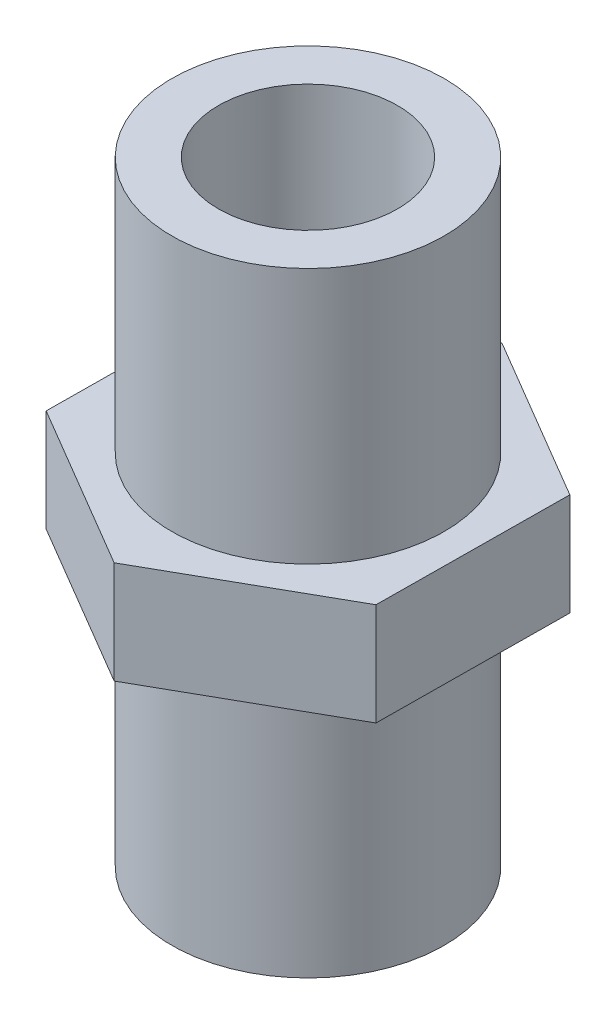
ISO-10303-21;
HEADER;
FILE_DESCRIPTION(('STEP AP214'),'2;1');
FILE_NAME('part.step','',(''),(''),'','','');
FILE_SCHEMA(('AUTOMOTIVE_DESIGN { 1 0 10303 214 1 1 1 1 }'));
ENDSEC;
DATA;
#1=APPLICATION_CONTEXT('core data for automotive mechanical design processes');
#2=APPLICATION_PROTOCOL_DEFINITION('international standard','automotive_design',2000,#1);
#3=PRODUCT_CONTEXT('',#1,'mechanical');
#4=PRODUCT('Part','Part','',(#3));
#5=PRODUCT_RELATED_PRODUCT_CATEGORY('part','',(#4));
#6=PRODUCT_DEFINITION_FORMATION('','',#4);
#7=PRODUCT_DEFINITION_CONTEXT('part definition',#1,'design');
#8=PRODUCT_DEFINITION('design','',#6,#7);
#9=PRODUCT_DEFINITION_SHAPE('','',#8);
#10=(LENGTH_UNIT() NAMED_UNIT(*) SI_UNIT(.MILLI.,.METRE.));
#11=(NAMED_UNIT(*) PLANE_ANGLE_UNIT() SI_UNIT($,.RADIAN.));
#12=(NAMED_UNIT(*) SI_UNIT($,.STERADIAN.) SOLID_ANGLE_UNIT());
#13=UNCERTAINTY_MEASURE_WITH_UNIT(LENGTH_MEASURE(1.E-05),#10,'distance_accuracy_value','');
#14=(GEOMETRIC_REPRESENTATION_CONTEXT(3) GLOBAL_UNCERTAINTY_ASSIGNED_CONTEXT((#13)) GLOBAL_UNIT_ASSIGNED_CONTEXT((#10,
#11,#12)) REPRESENTATION_CONTEXT('',''));
#15=CARTESIAN_POINT('',(0.,0.,0.));
#16=DIRECTION('',(0.,0.,1.));
#17=DIRECTION('',(1.,0.,0.));
#18=AXIS2_PLACEMENT_3D('',#15,#16,#17);
#19=CARTESIAN_POINT('',(0.,24.,7.7715611723761E-13));
#20=DIRECTION('',(0.,-1.,0.));
#21=DIRECTION('',(0.,0.,-1.));
#22=AXIS2_PLACEMENT_3D('',#19,#20,#21);
#23=CYLINDRICAL_SURFACE('',#22,10.65);
#24=CARTESIAN_POINT('',(0.,4.,0.));
#25=DIRECTION('',(0.,1.,0.));
#26=DIRECTION('',(0.,0.,1.));
#27=AXIS2_PLACEMENT_3D('',#24,#25,#26);
#28=CIRCLE('',#27,10.65);
#29=CARTESIAN_POINT('',(0.,4.00000000000001,-10.6499999999992));
#30=VERTEX_POINT('',#29);
#31=EDGE_CURVE('E144',#30,#30,#28,.T.);
#32=CARTESIAN_POINT('',(0.,24.,7.7715611723761E-13));
#33=DIRECTION('',(0.,1.,0.));
#34=DIRECTION('',(0.,0.,1.));
#35=AXIS2_PLACEMENT_3D('',#32,#33,#34);
#36=CIRCLE('',#35,10.65);
#37=CARTESIAN_POINT('',(0.,24.,-10.6499999999992));
#38=VERTEX_POINT('',#37);
#39=EDGE_CURVE('E145',#38,#38,#36,.T.);
#40=CARTESIAN_POINT('',(0.,4.00000000000001,-10.6499999999992));
#41=CARTESIAN_POINT('',(0.,4.20833333333334,-10.6499999999992));
#42=CARTESIAN_POINT('',(0.,4.41666666666667,-10.6499999999992));
#43=CARTESIAN_POINT('',(0.,4.83333333333334,-10.6499999999992));
#44=CARTESIAN_POINT('',(0.,5.04166666666667,-10.6499999999992));
#45=CARTESIAN_POINT('',(0.,5.45833333333334,-10.6499999999992));
#46=CARTESIAN_POINT('',(0.,5.66666666666667,-10.6499999999992));
#47=CARTESIAN_POINT('',(0.,6.08333333333334,-10.6499999999992));
#48=CARTESIAN_POINT('',(0.,6.29166666666668,-10.6499999999992));
#49=CARTESIAN_POINT('',(0.,6.70833333333334,-10.6499999999992));
#50=CARTESIAN_POINT('',(0.,6.91666666666668,-10.6499999999992));
#51=CARTESIAN_POINT('',(0.,7.33333333333334,-10.6499999999992));
#52=CARTESIAN_POINT('',(0.,7.54166666666668,-10.6499999999992));
#53=CARTESIAN_POINT('',(0.,7.95833333333334,-10.6499999999992));
#54=CARTESIAN_POINT('',(0.,8.16666666666668,-10.6499999999992));
#55=CARTESIAN_POINT('',(0.,8.58333333333334,-10.6499999999992));
#56=CARTESIAN_POINT('',(0.,8.79166666666668,-10.6499999999992));
#57=CARTESIAN_POINT('',(0.,9.20833333333334,-10.6499999999992));
#58=CARTESIAN_POINT('',(0.,9.41666666666668,-10.6499999999992));
#59=CARTESIAN_POINT('',(0.,9.83333333333334,-10.6499999999992));
#60=CARTESIAN_POINT('',(0.,10.0416666666667,-10.6499999999992));
#61=CARTESIAN_POINT('',(0.,10.4583333333333,-10.6499999999992));
#62=CARTESIAN_POINT('',(0.,10.6666666666667,-10.6499999999992));
#63=CARTESIAN_POINT('',(0.,11.0833333333333,-10.6499999999992));
#64=CARTESIAN_POINT('',(0.,11.2916666666667,-10.6499999999992));
#65=CARTESIAN_POINT('',(0.,11.7083333333333,-10.6499999999992));
#66=CARTESIAN_POINT('',(0.,11.9166666666667,-10.6499999999992));
#67=CARTESIAN_POINT('',(0.,12.3333333333333,-10.6499999999992));
#68=CARTESIAN_POINT('',(0.,12.5416666666667,-10.6499999999992));
#69=CARTESIAN_POINT('',(0.,12.9583333333333,-10.6499999999992));
#70=CARTESIAN_POINT('',(0.,13.1666666666667,-10.6499999999992));
#71=CARTESIAN_POINT('',(0.,13.5833333333333,-10.6499999999992));
#72=CARTESIAN_POINT('',(0.,13.7916666666667,-10.6499999999992));
#73=CARTESIAN_POINT('',(0.,14.2083333333333,-10.6499999999992));
#74=CARTESIAN_POINT('',(0.,14.4166666666667,-10.6499999999992));
#75=CARTESIAN_POINT('',(0.,14.8333333333333,-10.6499999999992));
#76=CARTESIAN_POINT('',(0.,15.0416666666667,-10.6499999999992));
#77=CARTESIAN_POINT('',(0.,15.4583333333333,-10.6499999999992));
#78=CARTESIAN_POINT('',(0.,15.6666666666667,-10.6499999999992));
#79=CARTESIAN_POINT('',(0.,16.0833333333334,-10.6499999999992));
#80=CARTESIAN_POINT('',(0.,16.2916666666667,-10.6499999999992));
#81=CARTESIAN_POINT('',(0.,16.7083333333334,-10.6499999999992));
#82=CARTESIAN_POINT('',(0.,16.9166666666667,-10.6499999999992));
#83=CARTESIAN_POINT('',(0.,17.3333333333334,-10.6499999999992));
#84=CARTESIAN_POINT('',(0.,17.5416666666667,-10.6499999999992));
#85=CARTESIAN_POINT('',(0.,17.9583333333334,-10.6499999999992));
#86=CARTESIAN_POINT('',(0.,18.1666666666667,-10.6499999999992));
#87=CARTESIAN_POINT('',(0.,18.5833333333334,-10.6499999999992));
#88=CARTESIAN_POINT('',(0.,18.7916666666667,-10.6499999999992));
#89=CARTESIAN_POINT('',(0.,19.2083333333334,-10.6499999999992));
#90=CARTESIAN_POINT('',(0.,19.4166666666667,-10.6499999999992));
#91=CARTESIAN_POINT('',(0.,19.8333333333334,-10.6499999999992));
#92=CARTESIAN_POINT('',(0.,20.0416666666667,-10.6499999999992));
#93=CARTESIAN_POINT('',(0.,20.4583333333334,-10.6499999999992));
#94=CARTESIAN_POINT('',(0.,20.6666666666667,-10.6499999999992));
#95=CARTESIAN_POINT('',(0.,21.0833333333334,-10.6499999999992));
#96=CARTESIAN_POINT('',(0.,21.2916666666667,-10.6499999999992));
#97=CARTESIAN_POINT('',(0.,21.7083333333334,-10.6499999999992));
#98=CARTESIAN_POINT('',(0.,21.9166666666667,-10.6499999999992));
#99=CARTESIAN_POINT('',(0.,22.3333333333334,-10.6499999999992));
#100=CARTESIAN_POINT('',(0.,22.5416666666667,-10.6499999999992));
#101=CARTESIAN_POINT('',(0.,22.9583333333334,-10.6499999999992));
#102=CARTESIAN_POINT('',(0.,23.1666666666667,-10.6499999999992));
#103=CARTESIAN_POINT('',(0.,23.5833333333334,-10.6499999999992));
#104=CARTESIAN_POINT('',(0.,23.7916666666667,-10.6499999999992));
#105=CARTESIAN_POINT('',(0.,24.,-10.6499999999992));
#106=B_SPLINE_CURVE_WITH_KNOTS('',3,(#40,#41,#42,#43,#44,#45,#46,#47,#48,#49,#50,#51,#52,#53,
#54,#55,#56,#57,#58,#59,#60,#61,#62,#63,#64,#65,#66,#67,#68,#69,#70,#71,#72,#73,#74,#75,#76,#77,
#78,#79,#80,#81,#82,#83,#84,#85,#86,#87,#88,#89,#90,#91,#92,#93,#94,#95,#96,#97,#98,#99,#100,
#101,#102,#103,#104,#105),.UNSPECIFIED.,.F.,.F.,(4,2,2,2,2,2,2,2,2,2,2,2,2,2,2,2,2,2,2,2,2,2,2,
2,2,2,2,2,2,2,2,2,4),(0.,0.625000000000001,1.25,1.875,2.5,3.125,3.75,4.375,5.,5.62500000000001,
6.25000000000001,6.87500000000001,7.50000000000001,8.12500000000001,8.75000000000001,
9.37500000000001,10.,10.625,11.25,11.875,12.5,13.125,13.75,14.375,15.,15.625,16.25,16.875,17.5,
18.125,18.75,19.375,20.),.UNSPECIFIED.);
#107=EDGE_CURVE('BSEAM38',#30,#38,#106,.T.);
#108=ORIENTED_EDGE('',*,*,#31,.T.);
#109=ORIENTED_EDGE('',*,*,#39,.F.);
#110=ORIENTED_EDGE('',*,*,#107,.T.);
#111=ORIENTED_EDGE('',*,*,#107,.F.);
#112=EDGE_LOOP('',(#108,#110,#109,#111));
#113=FACE_BOUND('',#112,.T.);
#114=ADVANCED_FACE('F38',(#113),#23,.T.);
#115=CARTESIAN_POINT('',(0.,24.,7.7715611723761E-13));
#116=DIRECTION('',(0.,1.,0.));
#117=DIRECTION('',(0.,0.,1.));
#118=AXIS2_PLACEMENT_3D('',#115,#116,#117);
#119=PLANE('',#118);
#120=CARTESIAN_POINT('',(0.,24.,7.7715611723761E-13));
#121=DIRECTION('',(0.,1.,0.));
#122=DIRECTION('',(0.,0.,1.));
#123=AXIS2_PLACEMENT_3D('',#120,#121,#122);
#124=CIRCLE('',#123,7.);
#125=CARTESIAN_POINT('',(0.,24.,7.00000000000067));
#126=VERTEX_POINT('',#125);
#127=EDGE_CURVE('E128',#126,#126,#124,.T.);
#128=ORIENTED_EDGE('',*,*,#127,.F.);
#129=EDGE_LOOP('',(#128));
#130=FACE_BOUND('',#129,.T.);
#131=ORIENTED_EDGE('',*,*,#39,.T.);
#132=EDGE_LOOP('',(#131));
#133=FACE_BOUND('',#132,.T.);
#134=ADVANCED_FACE('F171',(#130,#133),#119,.T.);
#135=CARTESIAN_POINT('',(12.9321995205376,3.99999999999989,7.62178121532975));
#136=DIRECTION('',(-0.999959824437242,0.,-0.00896378889999261));
#137=DIRECTION('',(-0.00896378889999261,0.,0.999959824437241));
#138=AXIS2_PLACEMENT_3D('',#135,#136,#137);
#139=PLANE('',#138);
#140=DIRECTION('',(0.00896378889999266,0.,-0.999959824437241));
#141=VECTOR('',#140,1.);
#142=CARTESIAN_POINT('',(12.932199520538,-4.00000000000011,7.62178121532997));
#143=LINE('',#142,#141);
#144=CARTESIAN_POINT('',(12.932199520538,-4.00000000000011,7.62178121532997));
#145=VERTEX_POINT('',#144);
#146=CARTESIAN_POINT('',(13.0667559148319,-3.99999999999989,-7.38872270392954));
#147=VERTEX_POINT('',#146);
#148=EDGE_CURVE('E124',#145,#147,#143,.T.);
#149=ORIENTED_EDGE('',*,*,#148,.T.);
#150=DIRECTION('',(0.,-1.,0.));
#151=VECTOR('',#150,1.);
#152=CARTESIAN_POINT('',(13.0667559148319,4.,-7.38872270392976));
#153=LINE('',#152,#151);
#154=CARTESIAN_POINT('',(13.0667559148319,4.,-7.38872270392976));
#155=VERTEX_POINT('',#154);
#156=EDGE_CURVE('E142',#155,#147,#153,.T.);
#157=ORIENTED_EDGE('',*,*,#156,.F.);
#158=DIRECTION('',(0.00896378889999266,0.,-0.999959824437241));
#159=VECTOR('',#158,1.);
#160=CARTESIAN_POINT('',(12.9321995205376,3.99999999999989,7.62178121532975));
#161=LINE('',#160,#159);
#162=CARTESIAN_POINT('',(12.9321995205376,3.99999999999989,7.62178121532975));
#163=VERTEX_POINT('',#162);
#164=EDGE_CURVE('E135',#163,#155,#161,.T.);
#165=ORIENTED_EDGE('',*,*,#164,.F.);
#166=DIRECTION('',(0.,-1.,0.));
#167=VECTOR('',#166,1.);
#168=CARTESIAN_POINT('',(12.9321995205376,3.99999999999989,7.62178121532975));
#169=LINE('',#168,#167);
#170=EDGE_CURVE('E120',#163,#145,#169,.T.);
#171=ORIENTED_EDGE('',*,*,#170,.T.);
#172=EDGE_LOOP('',(#149,#157,#165,#171));
#173=FACE_BOUND('',#172,.T.);
#174=ADVANCED_FACE('F175',(#173),#139,.F.);
#175=CARTESIAN_POINT('',(13.0667559148319,4.,-7.38872270392976));
#176=DIRECTION('',(-0.507742781120176,0.,0.861508716276482));
#177=DIRECTION('',(0.861508716276482,0.,0.507742781120175));
#178=AXIS2_PLACEMENT_3D('',#175,#176,#177);
#179=PLANE('',#178);
#180=DIRECTION('',(-0.861508716276482,0.,-0.507742781120175));
#181=VECTOR('',#180,1.);
#182=CARTESIAN_POINT('',(13.0667559148319,-3.99999999999989,-7.38872270392954));
#183=LINE('',#182,#181);
#184=CARTESIAN_POINT('',(0.13455639429516,-4.,-15.0105039192595));
#185=VERTEX_POINT('',#184);
#186=EDGE_CURVE('E127',#147,#185,#183,.T.);
#187=ORIENTED_EDGE('',*,*,#186,.T.);
#188=DIRECTION('',(0.,-1.,0.));
#189=VECTOR('',#188,1.);
#190=CARTESIAN_POINT('',(0.134556394293828,4.,-15.0105039192594));
#191=LINE('',#190,#189);
#192=CARTESIAN_POINT('',(0.134556394293828,4.,-15.0105039192594));
#193=VERTEX_POINT('',#192);
#194=EDGE_CURVE('E139',#193,#185,#191,.T.);
#195=ORIENTED_EDGE('',*,*,#194,.F.);
#196=DIRECTION('',(-0.861508716276482,0.,-0.507742781120175));
#197=VECTOR('',#196,1.);
#198=CARTESIAN_POINT('',(13.0667559148319,4.,-7.38872270392976));
#199=LINE('',#198,#197);
#200=EDGE_CURVE('E93',#155,#193,#199,.T.);
#201=ORIENTED_EDGE('',*,*,#200,.F.);
#202=ORIENTED_EDGE('',*,*,#156,.T.);
#203=EDGE_LOOP('',(#187,#195,#201,#202));
#204=FACE_BOUND('',#203,.T.);
#205=ADVANCED_FACE('F202',(#204),#179,.F.);
#206=CARTESIAN_POINT('',(0.134556394293828,4.,-15.0105039192594));
#207=DIRECTION('',(0.492217043317066,0.,0.870472505176475));
#208=DIRECTION('',(0.870472505176475,0.,-0.492217043317066));
#209=AXIS2_PLACEMENT_3D('',#206,#207,#208);
#210=PLANE('',#209);
#211=DIRECTION('',(-0.870472505176475,0.,0.492217043317066));
#212=VECTOR('',#211,1.);
#213=CARTESIAN_POINT('',(0.13455639429516,-4.,-15.0105039192595));
#214=LINE('',#213,#212);
#215=CARTESIAN_POINT('',(-12.9321995205363,-4.,-7.62178121532964));
#216=VERTEX_POINT('',#215);
#217=EDGE_CURVE('E130',#185,#216,#214,.T.);
#218=ORIENTED_EDGE('',*,*,#217,.T.);
#219=DIRECTION('',(0.,-1.,0.));
#220=VECTOR('',#219,1.);
#221=CARTESIAN_POINT('',(-12.9321995205367,4.,-7.62178121532853));
#222=LINE('',#221,#220);
#223=CARTESIAN_POINT('',(-12.9321995205367,4.,-7.62178121532853));
#224=VERTEX_POINT('',#223);
#225=EDGE_CURVE('E115',#224,#216,#222,.T.);
#226=ORIENTED_EDGE('',*,*,#225,.F.);
#227=DIRECTION('',(-0.870472505176475,0.,0.492217043317066));
#228=VECTOR('',#227,1.);
#229=CARTESIAN_POINT('',(0.134556394293828,4.,-15.0105039192594));
#230=LINE('',#229,#228);
#231=EDGE_CURVE('E106',#193,#224,#230,.T.);
#232=ORIENTED_EDGE('',*,*,#231,.F.);
#233=ORIENTED_EDGE('',*,*,#194,.T.);
#234=EDGE_LOOP('',(#218,#226,#232,#233));
#235=FACE_BOUND('',#234,.T.);
#236=ADVANCED_FACE('F204',(#235),#210,.F.);
#237=CARTESIAN_POINT('',(-12.9321995205367,4.,-7.62178121532853));
#238=DIRECTION('',(0.999959824437242,0.,0.00896378889999222));
#239=DIRECTION('',(0.0089637888999925,0.,-0.999959824437241));
#240=AXIS2_PLACEMENT_3D('',#237,#238,#239);
#241=PLANE('',#240);
#242=DIRECTION('',(-0.0089637888999925,0.,0.999959824437241));
#243=VECTOR('',#242,1.);
#244=CARTESIAN_POINT('',(-12.9321995205363,-4.,-7.62178121532964));
#245=LINE('',#244,#243);
#246=CARTESIAN_POINT('',(-13.0667559148296,-4.,7.38872270392976));
#247=VERTEX_POINT('',#246);
#248=EDGE_CURVE('E114',#216,#247,#245,.T.);
#249=ORIENTED_EDGE('',*,*,#248,.T.);
#250=DIRECTION('',(0.,-1.,0.));
#251=VECTOR('',#250,1.);
#252=CARTESIAN_POINT('',(-13.0667559148301,4.,7.3887227039301));
#253=LINE('',#252,#251);
#254=CARTESIAN_POINT('',(-13.0667559148301,4.,7.3887227039301));
#255=VERTEX_POINT('',#254);
#256=EDGE_CURVE('E111',#255,#247,#253,.T.);
#257=ORIENTED_EDGE('',*,*,#256,.F.);
#258=DIRECTION('',(-0.0089637888999925,0.,0.999959824437241));
#259=VECTOR('',#258,1.);
#260=CARTESIAN_POINT('',(-12.9321995205367,4.,-7.62178121532853));
#261=LINE('',#260,#259);
#262=EDGE_CURVE('E100',#224,#255,#261,.T.);
#263=ORIENTED_EDGE('',*,*,#262,.F.);
#264=ORIENTED_EDGE('',*,*,#225,.T.);
#265=EDGE_LOOP('',(#249,#257,#263,#264));
#266=FACE_BOUND('',#265,.T.);
#267=ADVANCED_FACE('F112',(#266),#241,.F.);
#268=CARTESIAN_POINT('',(-13.0667559148301,4.,7.3887227039301));
#269=DIRECTION('',(0.507742781120176,0.,-0.861508716276482));
#270=DIRECTION('',(-0.861508716276482,0.,-0.507742781120175));
#271=AXIS2_PLACEMENT_3D('',#268,#269,#270);
#272=PLANE('',#271);
#273=DIRECTION('',(0.861508716276482,0.,0.507742781120175));
#274=VECTOR('',#273,1.);
#275=CARTESIAN_POINT('',(-13.0667559148296,-4.,7.38872270392976));
#276=LINE('',#275,#274);
#277=CARTESIAN_POINT('',(-0.134556394292495,-4.,15.0105039192588));
#278=VERTEX_POINT('',#277);
#279=EDGE_CURVE('E78',#247,#278,#276,.T.);
#280=ORIENTED_EDGE('',*,*,#279,.T.);
#281=DIRECTION('',(0.,-1.,0.));
#282=VECTOR('',#281,1.);
#283=CARTESIAN_POINT('',(-0.134556394293384,4.,15.0105039192587));
#284=LINE('',#283,#282);
#285=CARTESIAN_POINT('',(-0.134556394293384,4.,15.0105039192587));
#286=VERTEX_POINT('',#285);
#287=EDGE_CURVE('E116',#286,#278,#284,.T.);
#288=ORIENTED_EDGE('',*,*,#287,.F.);
#289=DIRECTION('',(0.861508716276482,0.,0.507742781120175));
#290=VECTOR('',#289,1.);
#291=CARTESIAN_POINT('',(-13.0667559148301,4.,7.3887227039301));
#292=LINE('',#291,#290);
#293=EDGE_CURVE('E104',#255,#286,#292,.T.);
#294=ORIENTED_EDGE('',*,*,#293,.F.);
#295=ORIENTED_EDGE('',*,*,#256,.T.);
#296=EDGE_LOOP('',(#280,#288,#294,#295));
#297=FACE_BOUND('',#296,.T.);
#298=ADVANCED_FACE('F118',(#297),#272,.F.);
#299=CARTESIAN_POINT('',(-0.134556394293384,4.,15.0105039192587));
#300=DIRECTION('',(-0.492217043317067,0.,-0.870472505176475));
#301=DIRECTION('',(-0.870472505176474,0.,0.492217043317066));
#302=AXIS2_PLACEMENT_3D('',#299,#300,#301);
#303=PLANE('',#302);
#304=DIRECTION('',(0.870472505176475,0.,-0.492217043317066));
#305=VECTOR('',#304,1.);
#306=CARTESIAN_POINT('',(-0.134556394292495,-4.,15.0105039192588));
#307=LINE('',#306,#305);
#308=EDGE_CURVE('E84',#278,#145,#307,.T.);
#309=ORIENTED_EDGE('',*,*,#308,.T.);
#310=ORIENTED_EDGE('',*,*,#170,.F.);
#311=DIRECTION('',(0.870472505176475,0.,-0.492217043317066));
#312=VECTOR('',#311,1.);
#313=CARTESIAN_POINT('',(-0.134556394293384,4.,15.0105039192587));
#314=LINE('',#313,#312);
#315=EDGE_CURVE('E55',#286,#163,#314,.T.);
#316=ORIENTED_EDGE('',*,*,#315,.F.);
#317=ORIENTED_EDGE('',*,*,#287,.T.);
#318=EDGE_LOOP('',(#309,#310,#316,#317));
#319=FACE_BOUND('',#318,.T.);
#320=ADVANCED_FACE('F159',(#319),#303,.F.);
#321=CARTESIAN_POINT('',(0.,4.,0.));
#322=DIRECTION('',(0.,1.,0.));
#323=DIRECTION('',(0.,0.,1.));
#324=AXIS2_PLACEMENT_3D('',#321,#322,#323);
#325=PLANE('',#324);
#326=ORIENTED_EDGE('',*,*,#31,.F.);
#327=EDGE_LOOP('',(#326));
#328=FACE_BOUND('',#327,.T.);
#329=ORIENTED_EDGE('',*,*,#164,.T.);
#330=ORIENTED_EDGE('',*,*,#200,.T.);
#331=ORIENTED_EDGE('',*,*,#231,.T.);
#332=ORIENTED_EDGE('',*,*,#262,.T.);
#333=ORIENTED_EDGE('',*,*,#293,.T.);
#334=ORIENTED_EDGE('',*,*,#315,.T.);
#335=EDGE_LOOP('',(#329,#330,#331,#332,#333,#334));
#336=FACE_BOUND('',#335,.T.);
#337=ADVANCED_FACE('F102',(#328,#336),#325,.T.);
#338=CARTESIAN_POINT('',(0.,-4.,2.22044604925031E-13));
#339=DIRECTION('',(0.,1.,0.));
#340=DIRECTION('',(0.,0.,1.));
#341=AXIS2_PLACEMENT_3D('',#338,#339,#340);
#342=PLANE('',#341);
#343=CARTESIAN_POINT('',(0.,-4.,2.22044604925031E-13));
#344=DIRECTION('',(0.,1.,0.));
#345=DIRECTION('',(0.,0.,1.));
#346=AXIS2_PLACEMENT_3D('',#343,#344,#345);
#347=CIRCLE('',#346,10.65);
#348=CARTESIAN_POINT('',(0.,-4.,-10.6499999999992));
#349=VERTEX_POINT('',#348);
#350=EDGE_CURVE('E47',#349,#349,#347,.T.);
#351=ORIENTED_EDGE('',*,*,#350,.T.);
#352=EDGE_LOOP('',(#351));
#353=FACE_BOUND('',#352,.T.);
#354=ORIENTED_EDGE('',*,*,#148,.F.);
#355=ORIENTED_EDGE('',*,*,#308,.F.);
#356=ORIENTED_EDGE('',*,*,#279,.F.);
#357=ORIENTED_EDGE('',*,*,#248,.F.);
#358=ORIENTED_EDGE('',*,*,#217,.F.);
#359=ORIENTED_EDGE('',*,*,#186,.F.);
#360=EDGE_LOOP('',(#354,#355,#356,#357,#358,#359));
#361=FACE_BOUND('',#360,.T.);
#362=ADVANCED_FACE('F158',(#353,#361),#342,.F.);
#363=CARTESIAN_POINT('',(0.,-24.,6.66133814775094E-13));
#364=DIRECTION('',(0.,1.,0.));
#365=DIRECTION('',(0.,0.,1.));
#366=AXIS2_PLACEMENT_3D('',#363,#364,#365);
#367=CIRCLE('',#366,10.65);
#368=CARTESIAN_POINT('',(0.,-24.,-10.6499999999992));
#369=VERTEX_POINT('',#368);
#370=EDGE_CURVE('E148',#369,#369,#367,.T.);
#371=CARTESIAN_POINT('',(0.,-24.,-10.6499999999992));
#372=CARTESIAN_POINT('',(0.,-23.7916666666667,-10.6499999999992));
#373=CARTESIAN_POINT('',(0.,-23.5833333333334,-10.6499999999992));
#374=CARTESIAN_POINT('',(0.,-23.1666666666667,-10.6499999999992));
#375=CARTESIAN_POINT('',(0.,-22.9583333333334,-10.6499999999992));
#376=CARTESIAN_POINT('',(0.,-22.5416666666667,-10.6499999999992));
#377=CARTESIAN_POINT('',(0.,-22.3333333333334,-10.6499999999992));
#378=CARTESIAN_POINT('',(0.,-21.9166666666667,-10.6499999999992));
#379=CARTESIAN_POINT('',(0.,-21.7083333333334,-10.6499999999992));
#380=CARTESIAN_POINT('',(0.,-21.2916666666667,-10.6499999999992));
#381=CARTESIAN_POINT('',(0.,-21.0833333333334,-10.6499999999992));
#382=CARTESIAN_POINT('',(0.,-20.6666666666667,-10.6499999999992));
#383=CARTESIAN_POINT('',(0.,-20.4583333333334,-10.6499999999992));
#384=CARTESIAN_POINT('',(0.,-20.0416666666667,-10.6499999999992));
#385=CARTESIAN_POINT('',(0.,-19.8333333333334,-10.6499999999992));
#386=CARTESIAN_POINT('',(0.,-19.4166666666667,-10.6499999999992));
#387=CARTESIAN_POINT('',(0.,-19.2083333333334,-10.6499999999992));
#388=CARTESIAN_POINT('',(0.,-18.7916666666667,-10.6499999999992));
#389=CARTESIAN_POINT('',(0.,-18.5833333333334,-10.6499999999992));
#390=CARTESIAN_POINT('',(0.,-18.1666666666667,-10.6499999999992));
#391=CARTESIAN_POINT('',(0.,-17.9583333333334,-10.6499999999992));
#392=CARTESIAN_POINT('',(0.,-17.5416666666667,-10.6499999999992));
#393=CARTESIAN_POINT('',(0.,-17.3333333333334,-10.6499999999992));
#394=CARTESIAN_POINT('',(0.,-16.9166666666667,-10.6499999999992));
#395=CARTESIAN_POINT('',(0.,-16.7083333333334,-10.6499999999992));
#396=CARTESIAN_POINT('',(0.,-16.2916666666667,-10.6499999999992));
#397=CARTESIAN_POINT('',(0.,-16.0833333333334,-10.6499999999992));
#398=CARTESIAN_POINT('',(0.,-15.6666666666667,-10.6499999999992));
#399=CARTESIAN_POINT('',(0.,-15.4583333333334,-10.6499999999992));
#400=CARTESIAN_POINT('',(0.,-15.0416666666667,-10.6499999999992));
#401=CARTESIAN_POINT('',(0.,-14.8333333333334,-10.6499999999992));
#402=CARTESIAN_POINT('',(0.,-14.4166666666667,-10.6499999999992));
#403=CARTESIAN_POINT('',(0.,-14.2083333333334,-10.6499999999992));
#404=CARTESIAN_POINT('',(0.,-13.7916666666667,-10.6499999999992));
#405=CARTESIAN_POINT('',(0.,-13.5833333333334,-10.6499999999992));
#406=CARTESIAN_POINT('',(0.,-13.1666666666667,-10.6499999999992));
#407=CARTESIAN_POINT('',(0.,-12.9583333333334,-10.6499999999992));
#408=CARTESIAN_POINT('',(0.,-12.5416666666667,-10.6499999999992));
#409=CARTESIAN_POINT('',(0.,-12.3333333333333,-10.6499999999992));
#410=CARTESIAN_POINT('',(0.,-11.9166666666667,-10.6499999999992));
#411=CARTESIAN_POINT('',(0.,-11.7083333333333,-10.6499999999992));
#412=CARTESIAN_POINT('',(0.,-11.2916666666667,-10.6499999999992));
#413=CARTESIAN_POINT('',(0.,-11.0833333333333,-10.6499999999992));
#414=CARTESIAN_POINT('',(0.,-10.6666666666667,-10.6499999999992));
#415=CARTESIAN_POINT('',(0.,-10.4583333333333,-10.6499999999992));
#416=CARTESIAN_POINT('',(0.,-10.0416666666667,-10.6499999999992));
#417=CARTESIAN_POINT('',(0.,-9.83333333333334,-10.6499999999992));
#418=CARTESIAN_POINT('',(0.,-9.41666666666667,-10.6499999999992));
#419=CARTESIAN_POINT('',(0.,-9.20833333333334,-10.6499999999992));
#420=CARTESIAN_POINT('',(0.,-8.79166666666667,-10.6499999999992));
#421=CARTESIAN_POINT('',(0.,-8.58333333333334,-10.6499999999992));
#422=CARTESIAN_POINT('',(0.,-8.16666666666667,-10.6499999999992));
#423=CARTESIAN_POINT('',(0.,-7.95833333333334,-10.6499999999992));
#424=CARTESIAN_POINT('',(0.,-7.54166666666667,-10.6499999999992));
#425=CARTESIAN_POINT('',(0.,-7.33333333333334,-10.6499999999992));
#426=CARTESIAN_POINT('',(0.,-6.91666666666667,-10.6499999999992));
#427=CARTESIAN_POINT('',(0.,-6.70833333333334,-10.6499999999992));
#428=CARTESIAN_POINT('',(0.,-6.29166666666667,-10.6499999999992));
#429=CARTESIAN_POINT('',(0.,-6.08333333333334,-10.6499999999992));
#430=CARTESIAN_POINT('',(0.,-5.66666666666667,-10.6499999999992));
#431=CARTESIAN_POINT('',(0.,-5.45833333333334,-10.6499999999992));
#432=CARTESIAN_POINT('',(0.,-5.04166666666667,-10.6499999999992));
#433=CARTESIAN_POINT('',(0.,-4.83333333333334,-10.6499999999992));
#434=CARTESIAN_POINT('',(0.,-4.41666666666667,-10.6499999999992));
#435=CARTESIAN_POINT('',(0.,-4.20833333333334,-10.6499999999992));
#436=CARTESIAN_POINT('',(0.,-4.,-10.6499999999992));
#437=B_SPLINE_CURVE_WITH_KNOTS('',3,(#371,#372,#373,#374,#375,#376,#377,#378,#379,#380,#381,
#382,#383,#384,#385,#386,#387,#388,#389,#390,#391,#392,#393,#394,#395,#396,#397,#398,#399,#400,
#401,#402,#403,#404,#405,#406,#407,#408,#409,#410,#411,#412,#413,#414,#415,#416,#417,#418,#419,
#420,#421,#422,#423,#424,#425,#426,#427,#428,#429,#430,#431,#432,#433,#434,#435,#436),
.UNSPECIFIED.,.F.,.F.,(4,2,2,2,2,2,2,2,2,2,2,2,2,2,2,2,2,2,2,2,2,2,2,2,2,2,2,2,2,2,2,2,4),(0.,
0.625000000000001,1.24999999999999,1.87499999999999,2.5,3.125,3.75,4.375,5.,5.625,6.25,6.875,
7.5,8.125,8.75,9.375,10.,10.625,11.25,11.875,12.5,13.125,13.75,14.375,15.,15.625,16.25,16.875,
17.5,18.125,18.75,19.375,20.),.UNSPECIFIED.);
#438=EDGE_CURVE('BSEAM165',#369,#349,#437,.T.);
#439=ORIENTED_EDGE('',*,*,#370,.T.);
#440=ORIENTED_EDGE('',*,*,#350,.F.);
#441=ORIENTED_EDGE('',*,*,#438,.T.);
#442=ORIENTED_EDGE('',*,*,#438,.F.);
#443=EDGE_LOOP('',(#439,#441,#440,#442));
#444=FACE_BOUND('',#443,.T.);
#445=ADVANCED_FACE('F165',(#444),#23,.T.);
#446=CARTESIAN_POINT('',(0.,-24.,6.66133814775094E-13));
#447=DIRECTION('',(0.,1.,0.));
#448=DIRECTION('',(0.,0.,1.));
#449=AXIS2_PLACEMENT_3D('',#446,#447,#448);
#450=CYLINDRICAL_SURFACE('',#449,7.);
#451=CARTESIAN_POINT('',(-4.44089209850063E-13,-18.4793569215171,4.44089209850063E-13));
#452=DIRECTION('',(0.,-1.,0.));
#453=DIRECTION('',(0.,0.,-1.));
#454=AXIS2_PLACEMENT_3D('',#451,#452,#453);
#455=CIRCLE('',#454,7.);
#456=CARTESIAN_POINT('',(0.,-18.4793569215171,7.00000000000067));
#457=VERTEX_POINT('',#456);
#458=EDGE_CURVE('E11',#457,#457,#455,.T.);
#459=CARTESIAN_POINT('',(0.,-18.4793569215171,7.00000000000067));
#460=CARTESIAN_POINT('',(0.,-18.0368636202513,7.00000000000067));
#461=CARTESIAN_POINT('',(0.,-17.5943703189855,7.00000000000067));
#462=CARTESIAN_POINT('',(0.,-16.7093837164539,7.00000000000067));
#463=CARTESIAN_POINT('',(0.,-16.2668904151881,7.00000000000067));
#464=CARTESIAN_POINT('',(0.,-15.3819038126565,7.00000000000067));
#465=CARTESIAN_POINT('',(0.,-14.9394105113907,7.00000000000067));
#466=CARTESIAN_POINT('',(0.,-14.0544239088591,7.00000000000067));
#467=CARTESIAN_POINT('',(0.,-13.6119306075933,7.00000000000067));
#468=CARTESIAN_POINT('',(0.,-12.7269440050617,7.00000000000067));
#469=CARTESIAN_POINT('',(0.,-12.2844507037959,7.00000000000067));
#470=CARTESIAN_POINT('',(0.,-11.3994641012643,7.00000000000067));
#471=CARTESIAN_POINT('',(0.,-10.9569707999985,7.00000000000067));
#472=CARTESIAN_POINT('',(0.,-10.0719841974669,7.00000000000067));
#473=CARTESIAN_POINT('',(0.,-9.62949089620107,7.00000000000067));
#474=CARTESIAN_POINT('',(0.,-8.74450429366946,7.00000000000067));
#475=CARTESIAN_POINT('',(0.,-8.30201099240366,7.00000000000067));
#476=CARTESIAN_POINT('',(0.,-7.41702438987205,7.00000000000067));
#477=CARTESIAN_POINT('',(0.,-6.97453108860625,7.00000000000067));
#478=CARTESIAN_POINT('',(0.,-6.08954448607464,7.00000000000067));
#479=CARTESIAN_POINT('',(0.,-5.64705118480884,7.00000000000067));
#480=CARTESIAN_POINT('',(0.,-4.76206458227723,7.00000000000067));
#481=CARTESIAN_POINT('',(0.,-4.31957128101142,7.00000000000067));
#482=CARTESIAN_POINT('',(0.,-3.43458467847981,7.00000000000067));
#483=CARTESIAN_POINT('',(0.,-2.99209137721401,7.00000000000067));
#484=CARTESIAN_POINT('',(0.,-2.1071047746824,7.00000000000067));
#485=CARTESIAN_POINT('',(0.,-1.6646114734166,7.00000000000067));
#486=CARTESIAN_POINT('',(0.,-0.779624870884989,7.00000000000067));
#487=CARTESIAN_POINT('',(0.,-0.337131569619186,7.00000000000067));
#488=CARTESIAN_POINT('',(0.,0.54785503291242,7.00000000000067));
#489=CARTESIAN_POINT('',(0.,0.990348334178224,7.00000000000067));
#490=CARTESIAN_POINT('',(0.,1.87533493670983,7.00000000000067));
#491=CARTESIAN_POINT('',(0.,2.31782823797564,7.00000000000067));
#492=CARTESIAN_POINT('',(0.,3.20281484050724,7.00000000000067));
#493=CARTESIAN_POINT('',(0.,3.64530814177305,7.00000000000067));
#494=CARTESIAN_POINT('',(0.,4.53029474430465,7.00000000000067));
#495=CARTESIAN_POINT('',(0.,4.97278804557046,7.00000000000067));
#496=CARTESIAN_POINT('',(0.,5.85777464810207,7.00000000000067));
#497=CARTESIAN_POINT('',(0.,6.30026794936787,7.00000000000067));
#498=CARTESIAN_POINT('',(0.,7.18525455189948,7.00000000000067));
#499=CARTESIAN_POINT('',(0.,7.62774785316528,7.00000000000067));
#500=CARTESIAN_POINT('',(0.,8.51273445569689,7.00000000000067));
#501=CARTESIAN_POINT('',(0.,8.95522775696269,7.00000000000067));
#502=CARTESIAN_POINT('',(0.,9.8402143594943,7.00000000000067));
#503=CARTESIAN_POINT('',(0.,10.2827076607601,7.00000000000067));
#504=CARTESIAN_POINT('',(0.,11.1676942632917,7.00000000000067));
#505=CARTESIAN_POINT('',(0.,11.6101875645575,7.00000000000067));
#506=CARTESIAN_POINT('',(0.,12.4951741670891,7.00000000000067));
#507=CARTESIAN_POINT('',(0.,12.9376674683549,7.00000000000067));
#508=CARTESIAN_POINT('',(0.,13.8226540708865,7.00000000000067));
#509=CARTESIAN_POINT('',(0.,14.2651473721523,7.00000000000067));
#510=CARTESIAN_POINT('',(0.,15.150133974684,7.00000000000067));
#511=CARTESIAN_POINT('',(0.,15.5926272759498,7.00000000000067));
#512=CARTESIAN_POINT('',(0.,16.4776138784814,7.00000000000067));
#513=CARTESIAN_POINT('',(0.,16.9201071797472,7.00000000000067));
#514=CARTESIAN_POINT('',(0.,17.8050937822788,7.00000000000067));
#515=CARTESIAN_POINT('',(0.,18.2475870835446,7.00000000000067));
#516=CARTESIAN_POINT('',(0.,19.1325736860762,7.00000000000067));
#517=CARTESIAN_POINT('',(0.,19.575066987342,7.00000000000067));
#518=CARTESIAN_POINT('',(0.,20.4600535898736,7.00000000000067));
#519=CARTESIAN_POINT('',(0.,20.9025468911394,7.00000000000067));
#520=CARTESIAN_POINT('',(0.,21.787533493671,7.00000000000067));
#521=CARTESIAN_POINT('',(0.,22.2300267949368,7.00000000000067));
#522=CARTESIAN_POINT('',(0.,23.1150133974684,7.00000000000067));
#523=CARTESIAN_POINT('',(0.,23.5575066987342,7.00000000000067));
#524=CARTESIAN_POINT('',(0.,24.,7.00000000000067));
#525=B_SPLINE_CURVE_WITH_KNOTS('',3,(#459,#460,#461,#462,#463,#464,#465,#466,#467,#468,#469,
#470,#471,#472,#473,#474,#475,#476,#477,#478,#479,#480,#481,#482,#483,#484,#485,#486,#487,#488,
#489,#490,#491,#492,#493,#494,#495,#496,#497,#498,#499,#500,#501,#502,#503,#504,#505,#506,#507,
#508,#509,#510,#511,#512,#513,#514,#515,#516,#517,#518,#519,#520,#521,#522,#523,#524),
.UNSPECIFIED.,.F.,.F.,(4,2,2,2,2,2,2,2,2,2,2,2,2,2,2,2,2,2,2,2,2,2,2,2,2,2,2,2,2,2,2,2,4),(0.,
1.32747990379741,2.65495980759483,3.98243971139224,5.30991961518965,6.63739951898706,
7.96487942278447,9.29235932658188,10.6198392303793,11.9473191341767,13.2747990379741,
14.6022789417715,15.9297588455689,17.2572387493664,18.5847186531638,19.9121985569612,
21.2396784607586,22.567158364556,23.8946382683534,25.2221181721508,26.5495980759482,
27.8770779797456,29.2045578835431,30.5320377873405,31.8595176911379,33.1869975949353,
34.5144774987327,35.8419574025301,37.1694373063275,38.4969172101249,39.8243971139224,
41.1518770177198,42.4793569215172),.UNSPECIFIED.);
#526=EDGE_CURVE('BSEAM179',#457,#126,#525,.T.);
#527=ORIENTED_EDGE('',*,*,#458,.T.);
#528=ORIENTED_EDGE('',*,*,#127,.T.);
#529=ORIENTED_EDGE('',*,*,#526,.T.);
#530=ORIENTED_EDGE('',*,*,#526,.F.);
#531=EDGE_LOOP('',(#527,#529,#528,#530));
#532=FACE_BOUND('',#531,.T.);
#533=ADVANCED_FACE('F179',(#532),#450,.F.);
#534=CARTESIAN_POINT('',(-4.44089209850063E-13,-18.4793569215171,4.44089209850063E-13));
#535=DIRECTION('',(0.,-1.,0.));
#536=DIRECTION('',(0.,0.,-1.));
#537=AXIS2_PLACEMENT_3D('',#534,#535,#536);
#538=TOROIDAL_SURFACE('',#537,13.,6.);
#539=ORIENTED_EDGE('',*,*,#458,.F.);
#540=EDGE_LOOP('',(#539));
#541=FACE_BOUND('',#540,.T.);
#542=ORIENTED_EDGE('',*,*,#370,.F.);
#543=EDGE_LOOP('',(#542));
#544=FACE_BOUND('',#543,.T.);
#545=ADVANCED_FACE('F40',(#541,#544),#538,.T.);
#546=CLOSED_SHELL('',(#114,#134,#174,#205,#236,#267,#298,#320,#337,#362,#445,#533,#545));
#547=MANIFOLD_SOLID_BREP('B2',#546);
#548=ADVANCED_BREP_SHAPE_REPRESENTATION('',(#18,#547),#14);
#549=SHAPE_DEFINITION_REPRESENTATION(#9,#548);
ENDSEC;
END-ISO-10303-21;
